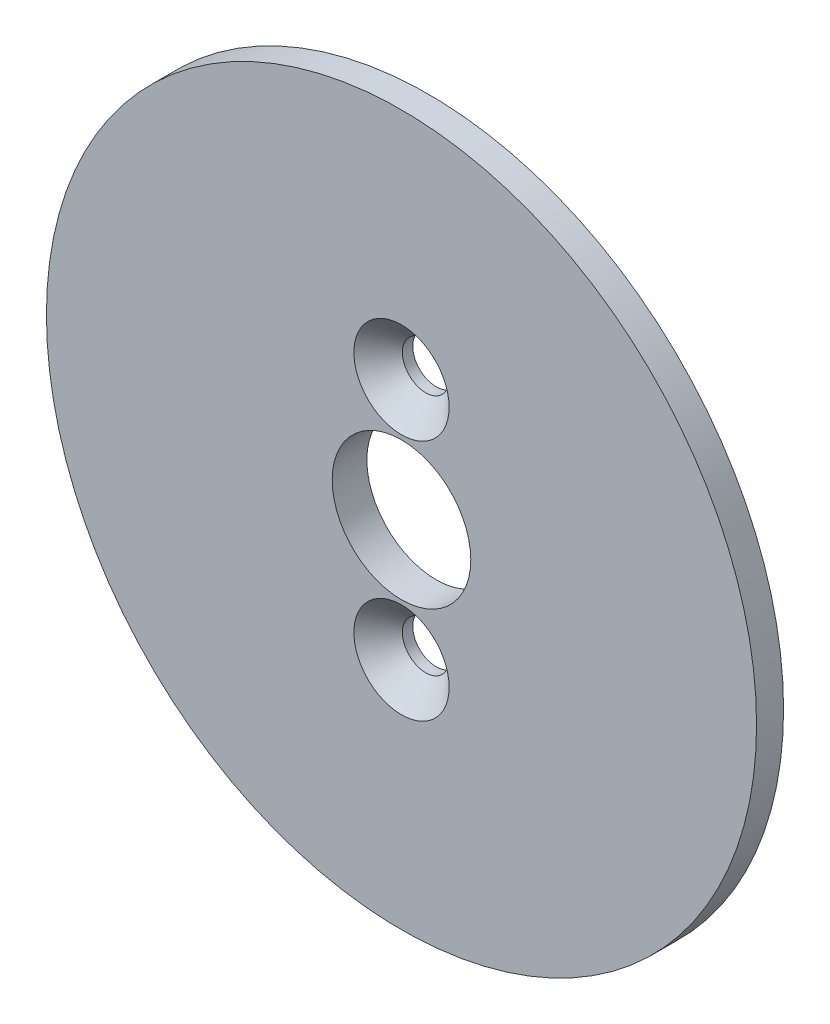
ISO-10303-21;
HEADER;
FILE_DESCRIPTION(('STEP AP214'),'2;1');
FILE_NAME('part.step','',(''),(''),'','','');
FILE_SCHEMA(('AUTOMOTIVE_DESIGN { 1 0 10303 214 1 1 1 1 }'));
ENDSEC;
DATA;
#1=APPLICATION_CONTEXT('core data for automotive mechanical design processes');
#2=APPLICATION_PROTOCOL_DEFINITION('international standard','automotive_design',2000,#1);
#3=PRODUCT_CONTEXT('',#1,'mechanical');
#4=PRODUCT('Part','Part','',(#3));
#5=PRODUCT_RELATED_PRODUCT_CATEGORY('part','',(#4));
#6=PRODUCT_DEFINITION_FORMATION('','',#4);
#7=PRODUCT_DEFINITION_CONTEXT('part definition',#1,'design');
#8=PRODUCT_DEFINITION('design','',#6,#7);
#9=PRODUCT_DEFINITION_SHAPE('','',#8);
#10=(LENGTH_UNIT() NAMED_UNIT(*) SI_UNIT(.MILLI.,.METRE.));
#11=(NAMED_UNIT(*) PLANE_ANGLE_UNIT() SI_UNIT($,.RADIAN.));
#12=(NAMED_UNIT(*) SI_UNIT($,.STERADIAN.) SOLID_ANGLE_UNIT());
#13=UNCERTAINTY_MEASURE_WITH_UNIT(LENGTH_MEASURE(1.E-05),#10,'distance_accuracy_value','');
#14=(GEOMETRIC_REPRESENTATION_CONTEXT(3) GLOBAL_UNCERTAINTY_ASSIGNED_CONTEXT((#13)) GLOBAL_UNIT_ASSIGNED_CONTEXT((#10,
#11,#12)) REPRESENTATION_CONTEXT('',''));
#15=CARTESIAN_POINT('',(0.,0.,0.));
#16=DIRECTION('',(0.,0.,1.));
#17=DIRECTION('',(1.,0.,0.));
#18=AXIS2_PLACEMENT_3D('',#15,#16,#17);
#19=CARTESIAN_POINT('',(0.,0.,2.));
#20=DIRECTION('',(0.,0.,-1.));
#21=DIRECTION('',(-1.,0.,0.));
#22=AXIS2_PLACEMENT_3D('',#19,#20,#21);
#23=CYLINDRICAL_SURFACE('',#22,20.5);
#24=CARTESIAN_POINT('',(0.,0.,2.));
#25=DIRECTION('',(0.,0.,1.));
#26=DIRECTION('',(1.,0.,0.));
#27=AXIS2_PLACEMENT_3D('',#24,#25,#26);
#28=CIRCLE('',#27,20.5);
#29=CARTESIAN_POINT('',(20.5,0.,2.));
#30=VERTEX_POINT('',#29);
#31=EDGE_CURVE('E10',#30,#30,#28,.T.);
#32=ORIENTED_EDGE('',*,*,#31,.F.);
#33=EDGE_LOOP('',(#32));
#34=FACE_BOUND('',#33,.T.);
#35=CARTESIAN_POINT('',(0.,0.,0.440817451771153));
#36=DIRECTION('',(0.,0.,1.));
#37=DIRECTION('',(1.,0.,0.));
#38=AXIS2_PLACEMENT_3D('',#35,#36,#37);
#39=CIRCLE('',#38,20.5);
#40=CARTESIAN_POINT('',(20.5,0.,0.440817451771153));
#41=VERTEX_POINT('',#40);
#42=EDGE_CURVE('E47',#41,#41,#39,.F.);
#43=ORIENTED_EDGE('',*,*,#42,.F.);
#44=EDGE_LOOP('',(#43));
#45=FACE_BOUND('',#44,.T.);
#46=ADVANCED_FACE('F40',(#34,#45),#23,.T.);
#47=CARTESIAN_POINT('',(0.,0.,2.));
#48=DIRECTION('',(0.,0.,1.));
#49=DIRECTION('',(1.,0.,0.));
#50=AXIS2_PLACEMENT_3D('',#47,#48,#49);
#51=PLANE('',#50);
#52=CARTESIAN_POINT('',(0.,7.,2.));
#53=DIRECTION('',(0.,0.,1.));
#54=DIRECTION('',(1.,0.,0.));
#55=AXIS2_PLACEMENT_3D('',#52,#53,#54);
#56=CIRCLE('',#55,2.75);
#57=CARTESIAN_POINT('',(2.75,7.,2.));
#58=VERTEX_POINT('',#57);
#59=EDGE_CURVE('E87',#58,#58,#56,.T.);
#60=ORIENTED_EDGE('',*,*,#59,.F.);
#61=EDGE_LOOP('',(#60));
#62=FACE_BOUND('',#61,.T.);
#63=CARTESIAN_POINT('',(0.,-7.,2.));
#64=DIRECTION('',(0.,0.,1.));
#65=DIRECTION('',(1.,0.,0.));
#66=AXIS2_PLACEMENT_3D('',#63,#64,#65);
#67=CIRCLE('',#66,2.75);
#68=CARTESIAN_POINT('',(2.75,-7.,2.));
#69=VERTEX_POINT('',#68);
#70=EDGE_CURVE('E75',#69,#69,#67,.T.);
#71=ORIENTED_EDGE('',*,*,#70,.F.);
#72=EDGE_LOOP('',(#71));
#73=FACE_BOUND('',#72,.T.);
#74=CARTESIAN_POINT('',(0.,0.,2.));
#75=DIRECTION('',(0.,0.,1.));
#76=DIRECTION('',(1.,0.,0.));
#77=AXIS2_PLACEMENT_3D('',#74,#75,#76);
#78=CIRCLE('',#77,4.);
#79=CARTESIAN_POINT('',(4.,0.,2.));
#80=VERTEX_POINT('',#79);
#81=EDGE_CURVE('E60',#80,#80,#78,.F.);
#82=ORIENTED_EDGE('',*,*,#81,.T.);
#83=EDGE_LOOP('',(#82));
#84=FACE_BOUND('',#83,.T.);
#85=ORIENTED_EDGE('',*,*,#31,.T.);
#86=EDGE_LOOP('',(#85));
#87=FACE_BOUND('',#86,.T.);
#88=ADVANCED_FACE('F94',(#62,#73,#84,#87),#51,.T.);
#89=CARTESIAN_POINT('',(0.,0.,0.));
#90=DIRECTION('',(0.,0.,1.));
#91=DIRECTION('',(1.,0.,0.));
#92=AXIS2_PLACEMENT_3D('',#89,#90,#91);
#93=CONICAL_SURFACE('',#92,18.,1.39626340159547);
#94=CARTESIAN_POINT('',(0.,0.,0.));
#95=DIRECTION('',(0.,0.,-1.));
#96=DIRECTION('',(-1.,0.,0.));
#97=AXIS2_PLACEMENT_3D('',#94,#95,#96);
#98=CIRCLE('',#97,18.);
#99=CARTESIAN_POINT('',(-18.,0.,0.));
#100=VERTEX_POINT('',#99);
#101=EDGE_CURVE('E52',#100,#100,#98,.T.);
#102=ORIENTED_EDGE('',*,*,#101,.F.);
#103=EDGE_LOOP('',(#102));
#104=FACE_BOUND('',#103,.T.);
#105=ORIENTED_EDGE('',*,*,#42,.T.);
#106=EDGE_LOOP('',(#105));
#107=FACE_BOUND('',#106,.T.);
#108=ADVANCED_FACE('F97',(#104,#107),#93,.T.);
#109=CARTESIAN_POINT('',(0.,0.,0.));
#110=DIRECTION('',(0.,0.,1.));
#111=DIRECTION('',(1.,0.,0.));
#112=AXIS2_PLACEMENT_3D('',#109,#110,#111);
#113=PLANE('',#112);
#114=CARTESIAN_POINT('',(0.,7.,0.));
#115=DIRECTION('',(0.,0.,1.));
#116=DIRECTION('',(1.,0.,0.));
#117=AXIS2_PLACEMENT_3D('',#114,#115,#116);
#118=CIRCLE('',#117,1.35);
#119=CARTESIAN_POINT('',(1.35,7.,0.));
#120=VERTEX_POINT('',#119);
#121=EDGE_CURVE('E79',#120,#120,#118,.T.);
#122=ORIENTED_EDGE('',*,*,#121,.T.);
#123=EDGE_LOOP('',(#122));
#124=FACE_BOUND('',#123,.T.);
#125=CARTESIAN_POINT('',(0.,-7.,0.));
#126=DIRECTION('',(0.,0.,1.));
#127=DIRECTION('',(1.,0.,0.));
#128=AXIS2_PLACEMENT_3D('',#125,#126,#127);
#129=CIRCLE('',#128,1.35);
#130=CARTESIAN_POINT('',(1.35,-7.,0.));
#131=VERTEX_POINT('',#130);
#132=EDGE_CURVE('E64',#131,#131,#129,.T.);
#133=ORIENTED_EDGE('',*,*,#132,.T.);
#134=EDGE_LOOP('',(#133));
#135=FACE_BOUND('',#134,.T.);
#136=CARTESIAN_POINT('',(0.,0.,0.));
#137=DIRECTION('',(0.,0.,-1.));
#138=DIRECTION('',(-1.,0.,0.));
#139=AXIS2_PLACEMENT_3D('',#136,#137,#138);
#140=CIRCLE('',#139,4.);
#141=CARTESIAN_POINT('',(-4.,0.,0.));
#142=VERTEX_POINT('',#141);
#143=EDGE_CURVE('E57',#142,#142,#140,.T.);
#144=ORIENTED_EDGE('',*,*,#143,.F.);
#145=EDGE_LOOP('',(#144));
#146=FACE_BOUND('',#145,.T.);
#147=ORIENTED_EDGE('',*,*,#101,.T.);
#148=EDGE_LOOP('',(#147));
#149=FACE_BOUND('',#148,.T.);
#150=ADVANCED_FACE('F107',(#124,#135,#146,#149),#113,.F.);
#151=CARTESIAN_POINT('',(0.,0.,2.001));
#152=DIRECTION('',(0.,0.,-1.));
#153=DIRECTION('',(-1.,0.,0.));
#154=AXIS2_PLACEMENT_3D('',#151,#152,#153);
#155=CYLINDRICAL_SURFACE('',#154,4.);
#156=ORIENTED_EDGE('',*,*,#81,.F.);
#157=EDGE_LOOP('',(#156));
#158=FACE_BOUND('',#157,.T.);
#159=ORIENTED_EDGE('',*,*,#143,.T.);
#160=EDGE_LOOP('',(#159));
#161=FACE_BOUND('',#160,.T.);
#162=ADVANCED_FACE('F103',(#158,#161),#155,.F.);
#163=CARTESIAN_POINT('',(0.,-7.,2.));
#164=DIRECTION('',(0.,0.,1.));
#165=DIRECTION('',(1.,0.,0.));
#166=AXIS2_PLACEMENT_3D('',#163,#164,#165);
#167=CYLINDRICAL_SURFACE('',#166,1.35);
#168=ORIENTED_EDGE('',*,*,#132,.F.);
#169=EDGE_LOOP('',(#168));
#170=FACE_BOUND('',#169,.T.);
#171=CARTESIAN_POINT('',(0.,-7.,0.599999999999998));
#172=DIRECTION('',(0.,0.,1.));
#173=DIRECTION('',(1.,0.,0.));
#174=AXIS2_PLACEMENT_3D('',#171,#172,#173);
#175=CIRCLE('',#174,1.35);
#176=CARTESIAN_POINT('',(1.35,-7.,0.599999999999998));
#177=VERTEX_POINT('',#176);
#178=EDGE_CURVE('E71',#177,#177,#175,.T.);
#179=ORIENTED_EDGE('',*,*,#178,.T.);
#180=EDGE_LOOP('',(#179));
#181=FACE_BOUND('',#180,.T.);
#182=ADVANCED_FACE('F106',(#170,#181),#167,.F.);
#183=CARTESIAN_POINT('',(0.,-7.,2.));
#184=DIRECTION('',(0.,0.,1.));
#185=DIRECTION('',(1.,0.,0.));
#186=AXIS2_PLACEMENT_3D('',#183,#184,#185);
#187=CONICAL_SURFACE('',#186,2.75,0.785398163397448);
#188=ORIENTED_EDGE('',*,*,#178,.F.);
#189=EDGE_LOOP('',(#188));
#190=FACE_BOUND('',#189,.T.);
#191=ORIENTED_EDGE('',*,*,#70,.T.);
#192=EDGE_LOOP('',(#191));
#193=FACE_BOUND('',#192,.T.);
#194=ADVANCED_FACE('F148',(#190,#193),#187,.F.);
#195=CARTESIAN_POINT('',(0.,7.,2.));
#196=DIRECTION('',(0.,0.,1.));
#197=DIRECTION('',(1.,0.,0.));
#198=AXIS2_PLACEMENT_3D('',#195,#196,#197);
#199=CYLINDRICAL_SURFACE('',#198,1.35);
#200=ORIENTED_EDGE('',*,*,#121,.F.);
#201=EDGE_LOOP('',(#200));
#202=FACE_BOUND('',#201,.T.);
#203=CARTESIAN_POINT('',(0.,7.,0.599999999999998));
#204=DIRECTION('',(0.,0.,1.));
#205=DIRECTION('',(1.,0.,0.));
#206=AXIS2_PLACEMENT_3D('',#203,#204,#205);
#207=CIRCLE('',#206,1.35);
#208=CARTESIAN_POINT('',(1.35,7.,0.599999999999998));
#209=VERTEX_POINT('',#208);
#210=EDGE_CURVE('E83',#209,#209,#207,.T.);
#211=ORIENTED_EDGE('',*,*,#210,.T.);
#212=EDGE_LOOP('',(#211));
#213=FACE_BOUND('',#212,.T.);
#214=ADVANCED_FACE('F159',(#202,#213),#199,.F.);
#215=CARTESIAN_POINT('',(0.,7.,2.));
#216=DIRECTION('',(0.,0.,1.));
#217=DIRECTION('',(1.,0.,0.));
#218=AXIS2_PLACEMENT_3D('',#215,#216,#217);
#219=CONICAL_SURFACE('',#218,2.75,0.785398163397448);
#220=ORIENTED_EDGE('',*,*,#210,.F.);
#221=EDGE_LOOP('',(#220));
#222=FACE_BOUND('',#221,.T.);
#223=ORIENTED_EDGE('',*,*,#59,.T.);
#224=EDGE_LOOP('',(#223));
#225=FACE_BOUND('',#224,.T.);
#226=ADVANCED_FACE('F92',(#222,#225),#219,.F.);
#227=CLOSED_SHELL('',(#46,#88,#108,#150,#162,#182,#194,#214,#226));
#228=MANIFOLD_SOLID_BREP('B2',#227);
#229=ADVANCED_BREP_SHAPE_REPRESENTATION('',(#18,#228),#14);
#230=SHAPE_DEFINITION_REPRESENTATION(#9,#229);
ENDSEC;
END-ISO-10303-21;
